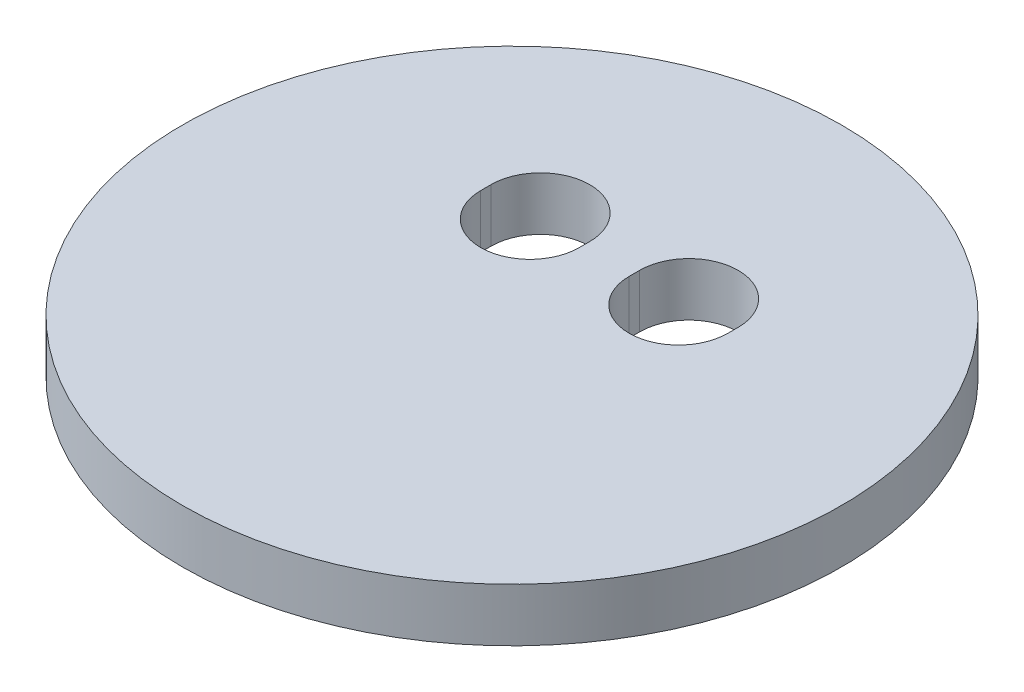
ISO-10303-21;
HEADER;
FILE_DESCRIPTION(('STEP AP214'),'2;1');
FILE_NAME('part.step','',(''),(''),'','','');
FILE_SCHEMA(('AUTOMOTIVE_DESIGN { 1 0 10303 214 1 1 1 1 }'));
ENDSEC;
DATA;
#1=APPLICATION_CONTEXT('core data for automotive mechanical design processes');
#2=APPLICATION_PROTOCOL_DEFINITION('international standard','automotive_design',2000,#1);
#3=PRODUCT_CONTEXT('',#1,'mechanical');
#4=PRODUCT('Part','Part','',(#3));
#5=PRODUCT_RELATED_PRODUCT_CATEGORY('part','',(#4));
#6=PRODUCT_DEFINITION_FORMATION('','',#4);
#7=PRODUCT_DEFINITION_CONTEXT('part definition',#1,'design');
#8=PRODUCT_DEFINITION('design','',#6,#7);
#9=PRODUCT_DEFINITION_SHAPE('','',#8);
#10=(LENGTH_UNIT() NAMED_UNIT(*) SI_UNIT(.MILLI.,.METRE.));
#11=(NAMED_UNIT(*) PLANE_ANGLE_UNIT() SI_UNIT($,.RADIAN.));
#12=(NAMED_UNIT(*) SI_UNIT($,.STERADIAN.) SOLID_ANGLE_UNIT());
#13=UNCERTAINTY_MEASURE_WITH_UNIT(LENGTH_MEASURE(1.E-05),#10,'distance_accuracy_value','');
#14=(GEOMETRIC_REPRESENTATION_CONTEXT(3) GLOBAL_UNCERTAINTY_ASSIGNED_CONTEXT((#13)) GLOBAL_UNIT_ASSIGNED_CONTEXT((#10,
#11,#12)) REPRESENTATION_CONTEXT('',''));
#15=CARTESIAN_POINT('',(0.,0.,0.));
#16=DIRECTION('',(0.,0.,1.));
#17=DIRECTION('',(1.,0.,0.));
#18=AXIS2_PLACEMENT_3D('',#15,#16,#17);
#19=CARTESIAN_POINT('',(0.,2.,0.));
#20=DIRECTION('',(0.,-1.,0.));
#21=DIRECTION('',(0.,0.,-1.));
#22=AXIS2_PLACEMENT_3D('',#19,#20,#21);
#23=CYLINDRICAL_SURFACE('',#22,12.36);
#24=CARTESIAN_POINT('',(0.,2.,0.));
#25=DIRECTION('',(0.,1.,0.));
#26=DIRECTION('',(0.,0.,1.));
#27=AXIS2_PLACEMENT_3D('',#24,#25,#26);
#28=CIRCLE('',#27,12.36);
#29=CARTESIAN_POINT('',(0.,2.,12.36));
#30=VERTEX_POINT('',#29);
#31=EDGE_CURVE('E11',#30,#30,#28,.T.);
#32=ORIENTED_EDGE('',*,*,#31,.F.);
#33=EDGE_LOOP('',(#32));
#34=FACE_BOUND('',#33,.T.);
#35=CARTESIAN_POINT('',(0.,0.,0.));
#36=DIRECTION('',(0.,1.,0.));
#37=DIRECTION('',(0.,0.,1.));
#38=AXIS2_PLACEMENT_3D('',#35,#36,#37);
#39=CIRCLE('',#38,12.36);
#40=CARTESIAN_POINT('',(0.,0.,12.36));
#41=VERTEX_POINT('',#40);
#42=EDGE_CURVE('E46',#41,#41,#39,.T.);
#43=ORIENTED_EDGE('',*,*,#42,.T.);
#44=EDGE_LOOP('',(#43));
#45=FACE_BOUND('',#44,.T.);
#46=ADVANCED_FACE('F43',(#34,#45),#23,.T.);
#47=CARTESIAN_POINT('',(0.,2.,0.));
#48=DIRECTION('',(0.,1.,0.));
#49=DIRECTION('',(0.,0.,1.));
#50=AXIS2_PLACEMENT_3D('',#47,#48,#49);
#51=PLANE('',#50);
#52=CARTESIAN_POINT('',(-2.785,2.,-3.85));
#53=DIRECTION('',(0.,1.,0.));
#54=DIRECTION('',(0.,0.,1.));
#55=AXIS2_PLACEMENT_3D('',#52,#53,#54);
#56=CIRCLE('',#55,1.85);
#57=CARTESIAN_POINT('',(-0.935000000000001,2.,-3.85));
#58=VERTEX_POINT('',#57);
#59=CARTESIAN_POINT('',(-4.635,2.,-3.85));
#60=VERTEX_POINT('',#59);
#61=EDGE_CURVE('E58',#58,#60,#56,.T.);
#62=ORIENTED_EDGE('',*,*,#61,.F.);
#63=DIRECTION('',(0.,0.,-1.));
#64=VECTOR('',#63,1.);
#65=CARTESIAN_POINT('',(-0.935000000000001,2.,-3.85));
#66=LINE('',#65,#64);
#67=CARTESIAN_POINT('',(-0.935000000000001,2.,-3.46000000000001));
#68=VERTEX_POINT('',#67);
#69=EDGE_CURVE('E132',#68,#58,#66,.T.);
#70=ORIENTED_EDGE('',*,*,#69,.F.);
#71=CARTESIAN_POINT('',(-2.785,2.,-3.46));
#72=DIRECTION('',(0.,1.,0.));
#73=DIRECTION('',(0.,0.,1.));
#74=AXIS2_PLACEMENT_3D('',#71,#72,#73);
#75=CIRCLE('',#74,1.85);
#76=CARTESIAN_POINT('',(-4.635,2.,-3.46));
#77=VERTEX_POINT('',#76);
#78=EDGE_CURVE('E136',#77,#68,#75,.T.);
#79=ORIENTED_EDGE('',*,*,#78,.F.);
#80=DIRECTION('',(0.,0.,1.));
#81=VECTOR('',#80,1.);
#82=CARTESIAN_POINT('',(-4.635,2.,-3.85));
#83=LINE('',#82,#81);
#84=EDGE_CURVE('E145',#60,#77,#83,.T.);
#85=ORIENTED_EDGE('',*,*,#84,.F.);
#86=EDGE_LOOP('',(#62,#70,#79,#85));
#87=FACE_BOUND('',#86,.T.);
#88=CARTESIAN_POINT('',(2.785,2.,-3.85));
#89=DIRECTION('',(0.,1.,0.));
#90=DIRECTION('',(0.,0.,1.));
#91=AXIS2_PLACEMENT_3D('',#88,#89,#90);
#92=CIRCLE('',#91,1.85);
#93=CARTESIAN_POINT('',(4.635,2.,-3.85));
#94=VERTEX_POINT('',#93);
#95=CARTESIAN_POINT('',(0.934999999999997,2.,-3.85));
#96=VERTEX_POINT('',#95);
#97=EDGE_CURVE('E66',#94,#96,#92,.T.);
#98=ORIENTED_EDGE('',*,*,#97,.F.);
#99=DIRECTION('',(0.,0.,-1.));
#100=VECTOR('',#99,1.);
#101=CARTESIAN_POINT('',(4.635,2.,-3.85));
#102=LINE('',#101,#100);
#103=CARTESIAN_POINT('',(4.635,2.,-3.46));
#104=VERTEX_POINT('',#103);
#105=EDGE_CURVE('E172',#104,#94,#102,.T.);
#106=ORIENTED_EDGE('',*,*,#105,.F.);
#107=CARTESIAN_POINT('',(2.785,2.,-3.46));
#108=DIRECTION('',(0.,1.,0.));
#109=DIRECTION('',(0.,0.,1.));
#110=AXIS2_PLACEMENT_3D('',#107,#108,#109);
#111=CIRCLE('',#110,1.85);
#112=CARTESIAN_POINT('',(0.934999999999996,2.,-3.46));
#113=VERTEX_POINT('',#112);
#114=EDGE_CURVE('E176',#113,#104,#111,.T.);
#115=ORIENTED_EDGE('',*,*,#114,.F.);
#116=DIRECTION('',(0.,0.,1.));
#117=VECTOR('',#116,1.);
#118=CARTESIAN_POINT('',(0.934999999999997,2.,-3.85));
#119=LINE('',#118,#117);
#120=EDGE_CURVE('E181',#96,#113,#119,.T.);
#121=ORIENTED_EDGE('',*,*,#120,.F.);
#122=EDGE_LOOP('',(#98,#106,#115,#121));
#123=FACE_BOUND('',#122,.T.);
#124=ORIENTED_EDGE('',*,*,#31,.T.);
#125=EDGE_LOOP('',(#124));
#126=FACE_BOUND('',#125,.T.);
#127=ADVANCED_FACE('F216',(#87,#123,#126),#51,.T.);
#128=CARTESIAN_POINT('',(0.,0.,0.));
#129=DIRECTION('',(0.,1.,0.));
#130=DIRECTION('',(0.,0.,1.));
#131=AXIS2_PLACEMENT_3D('',#128,#129,#130);
#132=PLANE('',#131);
#133=DIRECTION('',(0.,0.,-1.));
#134=VECTOR('',#133,1.);
#135=CARTESIAN_POINT('',(-0.935000000000001,0.,-3.85));
#136=LINE('',#135,#134);
#137=CARTESIAN_POINT('',(-0.935000000000001,0.,-3.46000000000001));
#138=VERTEX_POINT('',#137);
#139=CARTESIAN_POINT('',(-0.935000000000001,0.,-3.85));
#140=VERTEX_POINT('',#139);
#141=EDGE_CURVE('E117',#138,#140,#136,.T.);
#142=ORIENTED_EDGE('',*,*,#141,.T.);
#143=CARTESIAN_POINT('',(-2.785,0.,-3.85));
#144=DIRECTION('',(0.,1.,0.));
#145=DIRECTION('',(0.,0.,1.));
#146=AXIS2_PLACEMENT_3D('',#143,#144,#145);
#147=CIRCLE('',#146,1.85);
#148=CARTESIAN_POINT('',(-4.635,0.,-3.85));
#149=VERTEX_POINT('',#148);
#150=EDGE_CURVE('E110',#140,#149,#147,.T.);
#151=ORIENTED_EDGE('',*,*,#150,.T.);
#152=DIRECTION('',(0.,0.,1.));
#153=VECTOR('',#152,1.);
#154=CARTESIAN_POINT('',(-4.635,0.,-3.85));
#155=LINE('',#154,#153);
#156=CARTESIAN_POINT('',(-4.635,0.,-3.46));
#157=VERTEX_POINT('',#156);
#158=EDGE_CURVE('E121',#149,#157,#155,.T.);
#159=ORIENTED_EDGE('',*,*,#158,.T.);
#160=CARTESIAN_POINT('',(-2.785,0.,-3.46));
#161=DIRECTION('',(0.,1.,0.));
#162=DIRECTION('',(0.,0.,1.));
#163=AXIS2_PLACEMENT_3D('',#160,#161,#162);
#164=CIRCLE('',#163,1.85);
#165=EDGE_CURVE('E126',#157,#138,#164,.T.);
#166=ORIENTED_EDGE('',*,*,#165,.T.);
#167=EDGE_LOOP('',(#142,#151,#159,#166));
#168=FACE_BOUND('',#167,.T.);
#169=DIRECTION('',(0.,0.,-1.));
#170=VECTOR('',#169,1.);
#171=CARTESIAN_POINT('',(4.635,0.,-3.85));
#172=LINE('',#171,#170);
#173=CARTESIAN_POINT('',(4.635,0.,-3.46));
#174=VERTEX_POINT('',#173);
#175=CARTESIAN_POINT('',(4.635,0.,-3.85));
#176=VERTEX_POINT('',#175);
#177=EDGE_CURVE('E162',#174,#176,#172,.T.);
#178=ORIENTED_EDGE('',*,*,#177,.T.);
#179=CARTESIAN_POINT('',(2.785,0.,-3.85));
#180=DIRECTION('',(0.,1.,0.));
#181=DIRECTION('',(0.,0.,1.));
#182=AXIS2_PLACEMENT_3D('',#179,#180,#181);
#183=CIRCLE('',#182,1.85);
#184=CARTESIAN_POINT('',(0.934999999999997,0.,-3.85));
#185=VERTEX_POINT('',#184);
#186=EDGE_CURVE('E177',#176,#185,#183,.T.);
#187=ORIENTED_EDGE('',*,*,#186,.T.);
#188=DIRECTION('',(0.,0.,1.));
#189=VECTOR('',#188,1.);
#190=CARTESIAN_POINT('',(0.934999999999997,0.,-3.85));
#191=LINE('',#190,#189);
#192=CARTESIAN_POINT('',(0.934999999999997,0.,-3.46));
#193=VERTEX_POINT('',#192);
#194=EDGE_CURVE('E194',#185,#193,#191,.T.);
#195=ORIENTED_EDGE('',*,*,#194,.T.);
#196=CARTESIAN_POINT('',(2.785,0.,-3.46));
#197=DIRECTION('',(0.,1.,0.));
#198=DIRECTION('',(0.,0.,1.));
#199=AXIS2_PLACEMENT_3D('',#196,#197,#198);
#200=CIRCLE('',#199,1.85);
#201=EDGE_CURVE('E190',#193,#174,#200,.T.);
#202=ORIENTED_EDGE('',*,*,#201,.T.);
#203=EDGE_LOOP('',(#178,#187,#195,#202));
#204=FACE_BOUND('',#203,.T.);
#205=ORIENTED_EDGE('',*,*,#42,.F.);
#206=EDGE_LOOP('',(#205));
#207=FACE_BOUND('',#206,.T.);
#208=ADVANCED_FACE('F128',(#168,#204,#207),#132,.F.);
#209=CARTESIAN_POINT('',(2.785,0.,-3.85));
#210=DIRECTION('',(0.,1.,0.));
#211=DIRECTION('',(0.,0.,1.));
#212=AXIS2_PLACEMENT_3D('',#209,#210,#211);
#213=CYLINDRICAL_SURFACE('',#212,1.85);
#214=ORIENTED_EDGE('',*,*,#97,.T.);
#215=DIRECTION('',(0.,1.,0.));
#216=VECTOR('',#215,1.);
#217=CARTESIAN_POINT('',(0.934999999999997,0.,-3.85));
#218=LINE('',#217,#216);
#219=EDGE_CURVE('E159',#185,#96,#218,.T.);
#220=ORIENTED_EDGE('',*,*,#219,.F.);
#221=ORIENTED_EDGE('',*,*,#186,.F.);
#222=DIRECTION('',(0.,1.,0.));
#223=VECTOR('',#222,1.);
#224=CARTESIAN_POINT('',(4.635,0.,-3.85));
#225=LINE('',#224,#223);
#226=EDGE_CURVE('E169',#176,#94,#225,.T.);
#227=ORIENTED_EDGE('',*,*,#226,.T.);
#228=EDGE_LOOP('',(#214,#220,#221,#227));
#229=FACE_BOUND('',#228,.T.);
#230=ADVANCED_FACE('F204',(#229),#213,.F.);
#231=CARTESIAN_POINT('',(4.635,0.,-3.85));
#232=DIRECTION('',(1.,0.,0.));
#233=DIRECTION('',(0.,0.,-1.));
#234=AXIS2_PLACEMENT_3D('',#231,#232,#233);
#235=PLANE('',#234);
#236=ORIENTED_EDGE('',*,*,#105,.T.);
#237=ORIENTED_EDGE('',*,*,#226,.F.);
#238=ORIENTED_EDGE('',*,*,#177,.F.);
#239=DIRECTION('',(0.,1.,0.));
#240=VECTOR('',#239,1.);
#241=CARTESIAN_POINT('',(4.635,0.,-3.46));
#242=LINE('',#241,#240);
#243=EDGE_CURVE('E166',#174,#104,#242,.T.);
#244=ORIENTED_EDGE('',*,*,#243,.T.);
#245=EDGE_LOOP('',(#236,#237,#238,#244));
#246=FACE_BOUND('',#245,.T.);
#247=ADVANCED_FACE('F214',(#246),#235,.F.);
#248=CARTESIAN_POINT('',(2.785,0.,-3.46));
#249=DIRECTION('',(0.,1.,0.));
#250=DIRECTION('',(0.,0.,1.));
#251=AXIS2_PLACEMENT_3D('',#248,#249,#250);
#252=CYLINDRICAL_SURFACE('',#251,1.85);
#253=ORIENTED_EDGE('',*,*,#114,.T.);
#254=ORIENTED_EDGE('',*,*,#243,.F.);
#255=ORIENTED_EDGE('',*,*,#201,.F.);
#256=DIRECTION('',(0.,1.,0.));
#257=VECTOR('',#256,1.);
#258=CARTESIAN_POINT('',(0.934999999999996,0.,-3.46));
#259=LINE('',#258,#257);
#260=EDGE_CURVE('E163',#193,#113,#259,.T.);
#261=ORIENTED_EDGE('',*,*,#260,.T.);
#262=EDGE_LOOP('',(#253,#254,#255,#261));
#263=FACE_BOUND('',#262,.T.);
#264=ADVANCED_FACE('F211',(#263),#252,.F.);
#265=CARTESIAN_POINT('',(0.934999999999997,0.,-3.85));
#266=DIRECTION('',(-1.,0.,0.));
#267=DIRECTION('',(0.,0.,1.));
#268=AXIS2_PLACEMENT_3D('',#265,#266,#267);
#269=PLANE('',#268);
#270=ORIENTED_EDGE('',*,*,#120,.T.);
#271=ORIENTED_EDGE('',*,*,#260,.F.);
#272=ORIENTED_EDGE('',*,*,#194,.F.);
#273=ORIENTED_EDGE('',*,*,#219,.T.);
#274=EDGE_LOOP('',(#270,#271,#272,#273));
#275=FACE_BOUND('',#274,.T.);
#276=ADVANCED_FACE('F208',(#275),#269,.F.);
#277=CARTESIAN_POINT('',(-2.785,0.,-3.85));
#278=DIRECTION('',(0.,1.,0.));
#279=DIRECTION('',(0.,0.,1.));
#280=AXIS2_PLACEMENT_3D('',#277,#278,#279);
#281=CYLINDRICAL_SURFACE('',#280,1.85);
#282=ORIENTED_EDGE('',*,*,#61,.T.);
#283=DIRECTION('',(0.,1.,0.));
#284=VECTOR('',#283,1.);
#285=CARTESIAN_POINT('',(-4.635,0.,-3.85));
#286=LINE('',#285,#284);
#287=EDGE_CURVE('E106',#149,#60,#286,.T.);
#288=ORIENTED_EDGE('',*,*,#287,.F.);
#289=ORIENTED_EDGE('',*,*,#150,.F.);
#290=DIRECTION('',(0.,1.,0.));
#291=VECTOR('',#290,1.);
#292=CARTESIAN_POINT('',(-0.935000000000001,0.,-3.85));
#293=LINE('',#292,#291);
#294=EDGE_CURVE('E151',#140,#58,#293,.T.);
#295=ORIENTED_EDGE('',*,*,#294,.T.);
#296=EDGE_LOOP('',(#282,#288,#289,#295));
#297=FACE_BOUND('',#296,.T.);
#298=ADVANCED_FACE('F108',(#297),#281,.F.);
#299=CARTESIAN_POINT('',(-0.935000000000001,0.,-3.85));
#300=DIRECTION('',(1.,0.,0.));
#301=DIRECTION('',(0.,0.,-1.));
#302=AXIS2_PLACEMENT_3D('',#299,#300,#301);
#303=PLANE('',#302);
#304=ORIENTED_EDGE('',*,*,#69,.T.);
#305=ORIENTED_EDGE('',*,*,#294,.F.);
#306=ORIENTED_EDGE('',*,*,#141,.F.);
#307=DIRECTION('',(0.,1.,0.));
#308=VECTOR('',#307,1.);
#309=CARTESIAN_POINT('',(-0.935000000000001,0.,-3.46000000000001));
#310=LINE('',#309,#308);
#311=EDGE_CURVE('E154',#138,#68,#310,.T.);
#312=ORIENTED_EDGE('',*,*,#311,.T.);
#313=EDGE_LOOP('',(#304,#305,#306,#312));
#314=FACE_BOUND('',#313,.T.);
#315=ADVANCED_FACE('F242',(#314),#303,.F.);
#316=CARTESIAN_POINT('',(-2.785,0.,-3.46));
#317=DIRECTION('',(0.,1.,0.));
#318=DIRECTION('',(0.,0.,1.));
#319=AXIS2_PLACEMENT_3D('',#316,#317,#318);
#320=CYLINDRICAL_SURFACE('',#319,1.85);
#321=ORIENTED_EDGE('',*,*,#78,.T.);
#322=ORIENTED_EDGE('',*,*,#311,.F.);
#323=ORIENTED_EDGE('',*,*,#165,.F.);
#324=DIRECTION('',(0.,1.,0.));
#325=VECTOR('',#324,1.);
#326=CARTESIAN_POINT('',(-4.635,0.,-3.46));
#327=LINE('',#326,#325);
#328=EDGE_CURVE('E116',#157,#77,#327,.T.);
#329=ORIENTED_EDGE('',*,*,#328,.T.);
#330=EDGE_LOOP('',(#321,#322,#323,#329));
#331=FACE_BOUND('',#330,.T.);
#332=ADVANCED_FACE('F245',(#331),#320,.F.);
#333=CARTESIAN_POINT('',(-4.635,0.,-3.85));
#334=DIRECTION('',(-1.,0.,0.));
#335=DIRECTION('',(0.,0.,1.));
#336=AXIS2_PLACEMENT_3D('',#333,#334,#335);
#337=PLANE('',#336);
#338=ORIENTED_EDGE('',*,*,#84,.T.);
#339=ORIENTED_EDGE('',*,*,#328,.F.);
#340=ORIENTED_EDGE('',*,*,#158,.F.);
#341=ORIENTED_EDGE('',*,*,#287,.T.);
#342=EDGE_LOOP('',(#338,#339,#340,#341));
#343=FACE_BOUND('',#342,.T.);
#344=ADVANCED_FACE('F122',(#343),#337,.F.);
#345=CLOSED_SHELL('',(#46,#127,#208,#230,#247,#264,#276,#298,#315,#332,#344));
#346=MANIFOLD_SOLID_BREP('B2',#345);
#347=ADVANCED_BREP_SHAPE_REPRESENTATION('',(#18,#346),#14);
#348=SHAPE_DEFINITION_REPRESENTATION(#9,#347);
ENDSEC;
END-ISO-10303-21;
